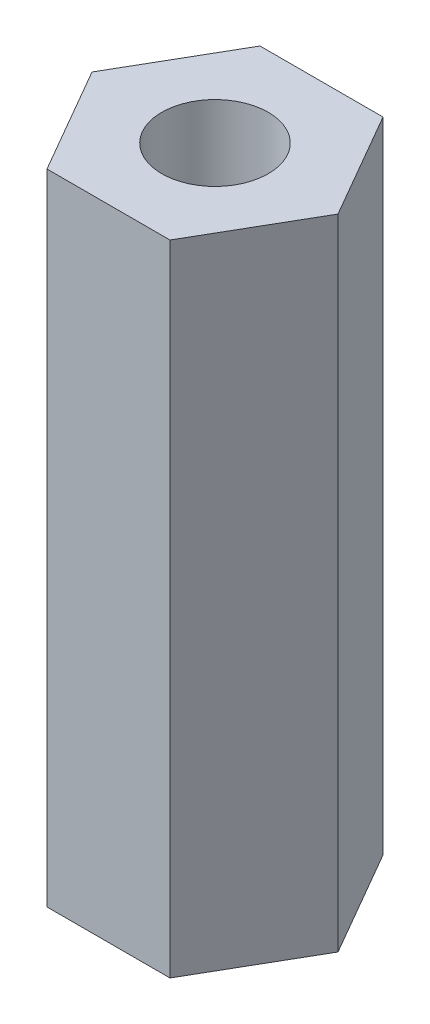
ISO-10303-21;
HEADER;
FILE_DESCRIPTION(('STEP AP214'),'2;1');
FILE_NAME('part.step','',(''),(''),'','','');
FILE_SCHEMA(('AUTOMOTIVE_DESIGN { 1 0 10303 214 1 1 1 1 }'));
ENDSEC;
DATA;
#1=APPLICATION_CONTEXT('core data for automotive mechanical design processes');
#2=APPLICATION_PROTOCOL_DEFINITION('international standard','automotive_design',2000,#1);
#3=PRODUCT_CONTEXT('',#1,'mechanical');
#4=PRODUCT('Part','Part','',(#3));
#5=PRODUCT_RELATED_PRODUCT_CATEGORY('part','',(#4));
#6=PRODUCT_DEFINITION_FORMATION('','',#4);
#7=PRODUCT_DEFINITION_CONTEXT('part definition',#1,'design');
#8=PRODUCT_DEFINITION('design','',#6,#7);
#9=PRODUCT_DEFINITION_SHAPE('','',#8);
#10=(LENGTH_UNIT() NAMED_UNIT(*) SI_UNIT(.MILLI.,.METRE.));
#11=(NAMED_UNIT(*) PLANE_ANGLE_UNIT() SI_UNIT($,.RADIAN.));
#12=(NAMED_UNIT(*) SI_UNIT($,.STERADIAN.) SOLID_ANGLE_UNIT());
#13=UNCERTAINTY_MEASURE_WITH_UNIT(LENGTH_MEASURE(1.E-05),#10,'distance_accuracy_value','');
#14=(GEOMETRIC_REPRESENTATION_CONTEXT(3) GLOBAL_UNCERTAINTY_ASSIGNED_CONTEXT((#13)) GLOBAL_UNIT_ASSIGNED_CONTEXT((#10,
#11,#12)) REPRESENTATION_CONTEXT('',''));
#15=CARTESIAN_POINT('',(0.,0.,0.));
#16=DIRECTION('',(0.,0.,1.));
#17=DIRECTION('',(1.,0.,0.));
#18=AXIS2_PLACEMENT_3D('',#15,#16,#17);
#19=CARTESIAN_POINT('',(0.,38.1,0.));
#20=DIRECTION('',(0.,1.,0.));
#21=DIRECTION('',(0.,0.,1.));
#22=AXIS2_PLACEMENT_3D('',#19,#20,#21);
#23=PLANE('',#22);
#24=DIRECTION('',(0.5,0.,-0.866025403784439));
#25=VECTOR('',#24,1.);
#26=CARTESIAN_POINT('',(3.66617420935413,38.1,6.35));
#27=LINE('',#26,#25);
#28=CARTESIAN_POINT('',(3.66617420935413,38.1,6.35));
#29=VERTEX_POINT('',#28);
#30=CARTESIAN_POINT('',(7.33234841870825,38.1,0.));
#31=VERTEX_POINT('',#30);
#32=EDGE_CURVE('E128',#29,#31,#27,.T.);
#33=ORIENTED_EDGE('',*,*,#32,.T.);
#34=DIRECTION('',(-0.5,0.,-0.866025403784439));
#35=VECTOR('',#34,1.);
#36=CARTESIAN_POINT('',(7.33234841870825,38.1,0.));
#37=LINE('',#36,#35);
#38=CARTESIAN_POINT('',(3.66617420935412,38.1,-6.35000000000001));
#39=VERTEX_POINT('',#38);
#40=EDGE_CURVE('E86',#31,#39,#37,.T.);
#41=ORIENTED_EDGE('',*,*,#40,.T.);
#42=DIRECTION('',(-1.,0.,0.));
#43=VECTOR('',#42,1.);
#44=CARTESIAN_POINT('',(3.66617420935412,38.1,-6.35000000000001));
#45=LINE('',#44,#43);
#46=CARTESIAN_POINT('',(-3.66617420935413,38.1,-6.35000000000001));
#47=VERTEX_POINT('',#46);
#48=EDGE_CURVE('E99',#39,#47,#45,.T.);
#49=ORIENTED_EDGE('',*,*,#48,.T.);
#50=DIRECTION('',(-0.5,0.,0.866025403784439));
#51=VECTOR('',#50,1.);
#52=CARTESIAN_POINT('',(-3.66617420935413,38.1,-6.35000000000001));
#53=LINE('',#52,#51);
#54=CARTESIAN_POINT('',(-7.33234841870825,38.1,0.));
#55=VERTEX_POINT('',#54);
#56=EDGE_CURVE('E93',#47,#55,#53,.T.);
#57=ORIENTED_EDGE('',*,*,#56,.T.);
#58=DIRECTION('',(0.5,0.,0.866025403784439));
#59=VECTOR('',#58,1.);
#60=CARTESIAN_POINT('',(-7.33234841870825,38.1,0.));
#61=LINE('',#60,#59);
#62=CARTESIAN_POINT('',(-3.66617420935413,38.1,6.35000000000001));
#63=VERTEX_POINT('',#62);
#64=EDGE_CURVE('E97',#55,#63,#61,.T.);
#65=ORIENTED_EDGE('',*,*,#64,.T.);
#66=DIRECTION('',(1.,0.,0.));
#67=VECTOR('',#66,1.);
#68=CARTESIAN_POINT('',(-3.66617420935413,38.1,6.35000000000001));
#69=LINE('',#68,#67);
#70=EDGE_CURVE('E49',#63,#29,#69,.T.);
#71=ORIENTED_EDGE('',*,*,#70,.T.);
#72=EDGE_LOOP('',(#33,#41,#49,#57,#65,#71));
#73=FACE_BOUND('',#72,.T.);
#74=CARTESIAN_POINT('',(0.,38.1,0.));
#75=DIRECTION('',(0.,1.,0.));
#76=DIRECTION('',(0.,0.,1.));
#77=AXIS2_PLACEMENT_3D('',#74,#75,#76);
#78=CIRCLE('',#77,3.175);
#79=CARTESIAN_POINT('',(0.,38.1,-3.175));
#80=VERTEX_POINT('',#79);
#81=EDGE_CURVE('E121',#80,#80,#78,.T.);
#82=ORIENTED_EDGE('',*,*,#81,.F.);
#83=EDGE_LOOP('',(#82));
#84=FACE_BOUND('',#83,.T.);
#85=ADVANCED_FACE('F32',(#73,#84),#23,.T.);
#86=CARTESIAN_POINT('',(0.,0.,0.));
#87=DIRECTION('',(0.,1.,0.));
#88=DIRECTION('',(0.,0.,1.));
#89=AXIS2_PLACEMENT_3D('',#86,#87,#88);
#90=PLANE('',#89);
#91=DIRECTION('',(0.5,0.,-0.866025403784439));
#92=VECTOR('',#91,1.);
#93=CARTESIAN_POINT('',(3.66617420935413,0.,6.35));
#94=LINE('',#93,#92);
#95=CARTESIAN_POINT('',(3.66617420935413,0.,6.35));
#96=VERTEX_POINT('',#95);
#97=CARTESIAN_POINT('',(7.33234841870825,0.,0.));
#98=VERTEX_POINT('',#97);
#99=EDGE_CURVE('E117',#96,#98,#94,.T.);
#100=ORIENTED_EDGE('',*,*,#99,.F.);
#101=DIRECTION('',(1.,0.,0.));
#102=VECTOR('',#101,1.);
#103=CARTESIAN_POINT('',(-3.66617420935413,0.,6.35000000000001));
#104=LINE('',#103,#102);
#105=CARTESIAN_POINT('',(-3.66617420935413,0.,6.35000000000001));
#106=VERTEX_POINT('',#105);
#107=EDGE_CURVE('E78',#106,#96,#104,.T.);
#108=ORIENTED_EDGE('',*,*,#107,.F.);
#109=DIRECTION('',(0.5,0.,0.866025403784439));
#110=VECTOR('',#109,1.);
#111=CARTESIAN_POINT('',(-7.33234841870825,0.,0.));
#112=LINE('',#111,#110);
#113=CARTESIAN_POINT('',(-7.33234841870825,0.,0.));
#114=VERTEX_POINT('',#113);
#115=EDGE_CURVE('E72',#114,#106,#112,.T.);
#116=ORIENTED_EDGE('',*,*,#115,.F.);
#117=DIRECTION('',(-0.5,0.,0.866025403784439));
#118=VECTOR('',#117,1.);
#119=CARTESIAN_POINT('',(-3.66617420935413,0.,-6.35000000000001));
#120=LINE('',#119,#118);
#121=CARTESIAN_POINT('',(-3.66617420935413,0.,-6.35000000000001));
#122=VERTEX_POINT('',#121);
#123=EDGE_CURVE('E107',#122,#114,#120,.T.);
#124=ORIENTED_EDGE('',*,*,#123,.F.);
#125=DIRECTION('',(-1.,0.,0.));
#126=VECTOR('',#125,1.);
#127=CARTESIAN_POINT('',(3.66617420935412,0.,-6.35000000000001));
#128=LINE('',#127,#126);
#129=CARTESIAN_POINT('',(3.66617420935412,0.,-6.35000000000001));
#130=VERTEX_POINT('',#129);
#131=EDGE_CURVE('E123',#130,#122,#128,.T.);
#132=ORIENTED_EDGE('',*,*,#131,.F.);
#133=DIRECTION('',(-0.5,0.,-0.866025403784439));
#134=VECTOR('',#133,1.);
#135=CARTESIAN_POINT('',(7.33234841870825,0.,0.));
#136=LINE('',#135,#134);
#137=EDGE_CURVE('E120',#98,#130,#136,.T.);
#138=ORIENTED_EDGE('',*,*,#137,.F.);
#139=EDGE_LOOP('',(#100,#108,#116,#124,#132,#138));
#140=FACE_BOUND('',#139,.T.);
#141=CARTESIAN_POINT('',(0.,0.,0.));
#142=DIRECTION('',(0.,1.,0.));
#143=DIRECTION('',(0.,0.,1.));
#144=AXIS2_PLACEMENT_3D('',#141,#142,#143);
#145=CIRCLE('',#144,3.175);
#146=CARTESIAN_POINT('',(0.,0.,-3.175));
#147=VERTEX_POINT('',#146);
#148=EDGE_CURVE('E221',#147,#147,#145,.T.);
#149=ORIENTED_EDGE('',*,*,#148,.T.);
#150=EDGE_LOOP('',(#149));
#151=FACE_BOUND('',#150,.T.);
#152=ADVANCED_FACE('F137',(#140,#151),#90,.F.);
#153=CARTESIAN_POINT('',(3.66617420935413,38.1,6.35));
#154=DIRECTION('',(-0.866025403784439,0.,-0.5));
#155=DIRECTION('',(-0.5,0.,0.866025403784439));
#156=AXIS2_PLACEMENT_3D('',#153,#154,#155);
#157=PLANE('',#156);
#158=ORIENTED_EDGE('',*,*,#99,.T.);
#159=DIRECTION('',(0.,-1.,0.));
#160=VECTOR('',#159,1.);
#161=CARTESIAN_POINT('',(7.33234841870825,38.1,0.));
#162=LINE('',#161,#160);
#163=EDGE_CURVE('E11',#31,#98,#162,.T.);
#164=ORIENTED_EDGE('',*,*,#163,.F.);
#165=ORIENTED_EDGE('',*,*,#32,.F.);
#166=DIRECTION('',(0.,-1.,0.));
#167=VECTOR('',#166,1.);
#168=CARTESIAN_POINT('',(3.66617420935413,38.1,6.35));
#169=LINE('',#168,#167);
#170=EDGE_CURVE('E113',#29,#96,#169,.T.);
#171=ORIENTED_EDGE('',*,*,#170,.T.);
#172=EDGE_LOOP('',(#158,#164,#165,#171));
#173=FACE_BOUND('',#172,.T.);
#174=ADVANCED_FACE('F34',(#173),#157,.F.);
#175=CARTESIAN_POINT('',(7.33234841870825,38.1,0.));
#176=DIRECTION('',(-0.866025403784439,0.,0.5));
#177=DIRECTION('',(0.5,0.,0.866025403784439));
#178=AXIS2_PLACEMENT_3D('',#175,#176,#177);
#179=PLANE('',#178);
#180=ORIENTED_EDGE('',*,*,#137,.T.);
#181=DIRECTION('',(0.,-1.,0.));
#182=VECTOR('',#181,1.);
#183=CARTESIAN_POINT('',(3.66617420935412,38.1,-6.35000000000001));
#184=LINE('',#183,#182);
#185=EDGE_CURVE('E41',#39,#130,#184,.T.);
#186=ORIENTED_EDGE('',*,*,#185,.F.);
#187=ORIENTED_EDGE('',*,*,#40,.F.);
#188=ORIENTED_EDGE('',*,*,#163,.T.);
#189=EDGE_LOOP('',(#180,#186,#187,#188));
#190=FACE_BOUND('',#189,.T.);
#191=ADVANCED_FACE('F162',(#190),#179,.F.);
#192=CARTESIAN_POINT('',(3.66617420935412,38.1,-6.35000000000001));
#193=DIRECTION('',(0.,0.,1.));
#194=DIRECTION('',(1.,0.,0.));
#195=AXIS2_PLACEMENT_3D('',#192,#193,#194);
#196=PLANE('',#195);
#197=ORIENTED_EDGE('',*,*,#131,.T.);
#198=DIRECTION('',(0.,-1.,0.));
#199=VECTOR('',#198,1.);
#200=CARTESIAN_POINT('',(-3.66617420935413,38.1,-6.35000000000001));
#201=LINE('',#200,#199);
#202=EDGE_CURVE('E108',#47,#122,#201,.T.);
#203=ORIENTED_EDGE('',*,*,#202,.F.);
#204=ORIENTED_EDGE('',*,*,#48,.F.);
#205=ORIENTED_EDGE('',*,*,#185,.T.);
#206=EDGE_LOOP('',(#197,#203,#204,#205));
#207=FACE_BOUND('',#206,.T.);
#208=ADVANCED_FACE('F134',(#207),#196,.F.);
#209=CARTESIAN_POINT('',(-3.66617420935413,38.1,-6.35000000000001));
#210=DIRECTION('',(0.866025403784439,0.,0.5));
#211=DIRECTION('',(0.5,0.,-0.866025403784439));
#212=AXIS2_PLACEMENT_3D('',#209,#210,#211);
#213=PLANE('',#212);
#214=ORIENTED_EDGE('',*,*,#123,.T.);
#215=DIRECTION('',(0.,-1.,0.));
#216=VECTOR('',#215,1.);
#217=CARTESIAN_POINT('',(-7.33234841870825,38.1,0.));
#218=LINE('',#217,#216);
#219=EDGE_CURVE('E104',#55,#114,#218,.T.);
#220=ORIENTED_EDGE('',*,*,#219,.F.);
#221=ORIENTED_EDGE('',*,*,#56,.F.);
#222=ORIENTED_EDGE('',*,*,#202,.T.);
#223=EDGE_LOOP('',(#214,#220,#221,#222));
#224=FACE_BOUND('',#223,.T.);
#225=ADVANCED_FACE('F105',(#224),#213,.F.);
#226=CARTESIAN_POINT('',(-7.33234841870825,38.1,0.));
#227=DIRECTION('',(0.866025403784439,0.,-0.5));
#228=DIRECTION('',(-0.5,0.,-0.866025403784439));
#229=AXIS2_PLACEMENT_3D('',#226,#227,#228);
#230=PLANE('',#229);
#231=ORIENTED_EDGE('',*,*,#115,.T.);
#232=DIRECTION('',(0.,-1.,0.));
#233=VECTOR('',#232,1.);
#234=CARTESIAN_POINT('',(-3.66617420935413,38.1,6.35000000000001));
#235=LINE('',#234,#233);
#236=EDGE_CURVE('E109',#63,#106,#235,.T.);
#237=ORIENTED_EDGE('',*,*,#236,.F.);
#238=ORIENTED_EDGE('',*,*,#64,.F.);
#239=ORIENTED_EDGE('',*,*,#219,.T.);
#240=EDGE_LOOP('',(#231,#237,#238,#239));
#241=FACE_BOUND('',#240,.T.);
#242=ADVANCED_FACE('F111',(#241),#230,.F.);
#243=CARTESIAN_POINT('',(-3.66617420935413,38.1,6.35000000000001));
#244=DIRECTION('',(0.,0.,-1.));
#245=DIRECTION('',(-1.,0.,0.));
#246=AXIS2_PLACEMENT_3D('',#243,#244,#245);
#247=PLANE('',#246);
#248=ORIENTED_EDGE('',*,*,#107,.T.);
#249=ORIENTED_EDGE('',*,*,#170,.F.);
#250=ORIENTED_EDGE('',*,*,#70,.F.);
#251=ORIENTED_EDGE('',*,*,#236,.T.);
#252=EDGE_LOOP('',(#248,#249,#250,#251));
#253=FACE_BOUND('',#252,.T.);
#254=ADVANCED_FACE('F142',(#253),#247,.F.);
#255=CARTESIAN_POINT('',(0.,38.1,0.));
#256=DIRECTION('',(0.,-1.,0.));
#257=DIRECTION('',(0.,0.,-1.));
#258=AXIS2_PLACEMENT_3D('',#255,#256,#257);
#259=CYLINDRICAL_SURFACE('',#258,3.175);
#260=CARTESIAN_POINT('',(0.,38.1,-3.175));
#261=CARTESIAN_POINT('',(0.,37.703125,-3.175));
#262=CARTESIAN_POINT('',(0.,37.30625,-3.175));
#263=CARTESIAN_POINT('',(0.,36.5125,-3.175));
#264=CARTESIAN_POINT('',(0.,36.115625,-3.175));
#265=CARTESIAN_POINT('',(0.,35.321875,-3.175));
#266=CARTESIAN_POINT('',(0.,34.925,-3.175));
#267=CARTESIAN_POINT('',(0.,34.13125,-3.175));
#268=CARTESIAN_POINT('',(0.,33.734375,-3.175));
#269=CARTESIAN_POINT('',(0.,32.940625,-3.175));
#270=CARTESIAN_POINT('',(0.,32.54375,-3.175));
#271=CARTESIAN_POINT('',(0.,31.75,-3.175));
#272=CARTESIAN_POINT('',(0.,31.353125,-3.175));
#273=CARTESIAN_POINT('',(0.,30.559375,-3.175));
#274=CARTESIAN_POINT('',(0.,30.1625,-3.175));
#275=CARTESIAN_POINT('',(0.,29.36875,-3.175));
#276=CARTESIAN_POINT('',(0.,28.971875,-3.175));
#277=CARTESIAN_POINT('',(0.,28.178125,-3.175));
#278=CARTESIAN_POINT('',(0.,27.78125,-3.175));
#279=CARTESIAN_POINT('',(0.,26.9875,-3.175));
#280=CARTESIAN_POINT('',(0.,26.590625,-3.175));
#281=CARTESIAN_POINT('',(0.,25.796875,-3.175));
#282=CARTESIAN_POINT('',(0.,25.4,-3.175));
#283=CARTESIAN_POINT('',(0.,24.60625,-3.175));
#284=CARTESIAN_POINT('',(0.,24.209375,-3.175));
#285=CARTESIAN_POINT('',(0.,23.415625,-3.175));
#286=CARTESIAN_POINT('',(0.,23.01875,-3.175));
#287=CARTESIAN_POINT('',(0.,22.225,-3.175));
#288=CARTESIAN_POINT('',(0.,21.828125,-3.175));
#289=CARTESIAN_POINT('',(0.,21.034375,-3.175));
#290=CARTESIAN_POINT('',(0.,20.6375,-3.175));
#291=CARTESIAN_POINT('',(0.,19.84375,-3.175));
#292=CARTESIAN_POINT('',(0.,19.446875,-3.175));
#293=CARTESIAN_POINT('',(0.,18.653125,-3.175));
#294=CARTESIAN_POINT('',(0.,18.25625,-3.175));
#295=CARTESIAN_POINT('',(0.,17.4625,-3.175));
#296=CARTESIAN_POINT('',(0.,17.065625,-3.175));
#297=CARTESIAN_POINT('',(0.,16.271875,-3.175));
#298=CARTESIAN_POINT('',(0.,15.875,-3.175));
#299=CARTESIAN_POINT('',(0.,15.08125,-3.175));
#300=CARTESIAN_POINT('',(0.,14.684375,-3.175));
#301=CARTESIAN_POINT('',(0.,13.890625,-3.175));
#302=CARTESIAN_POINT('',(0.,13.49375,-3.175));
#303=CARTESIAN_POINT('',(0.,12.7,-3.175));
#304=CARTESIAN_POINT('',(0.,12.303125,-3.175));
#305=CARTESIAN_POINT('',(0.,11.509375,-3.175));
#306=CARTESIAN_POINT('',(0.,11.1125,-3.175));
#307=CARTESIAN_POINT('',(0.,10.31875,-3.175));
#308=CARTESIAN_POINT('',(0.,9.921875,-3.175));
#309=CARTESIAN_POINT('',(0.,9.128125,-3.175));
#310=CARTESIAN_POINT('',(0.,8.73125,-3.175));
#311=CARTESIAN_POINT('',(0.,7.9375,-3.175));
#312=CARTESIAN_POINT('',(0.,7.540625,-3.175));
#313=CARTESIAN_POINT('',(0.,6.746875,-3.175));
#314=CARTESIAN_POINT('',(0.,6.35,-3.175));
#315=CARTESIAN_POINT('',(0.,5.55625,-3.175));
#316=CARTESIAN_POINT('',(0.,5.159375,-3.175));
#317=CARTESIAN_POINT('',(0.,4.365625,-3.175));
#318=CARTESIAN_POINT('',(0.,3.96875,-3.175));
#319=CARTESIAN_POINT('',(0.,3.175,-3.175));
#320=CARTESIAN_POINT('',(0.,2.778125,-3.175));
#321=CARTESIAN_POINT('',(0.,1.984375,-3.175));
#322=CARTESIAN_POINT('',(0.,1.5875,-3.175));
#323=CARTESIAN_POINT('',(0.,0.79375,-3.175));
#324=CARTESIAN_POINT('',(0.,0.396875,-3.175));
#325=CARTESIAN_POINT('',(0.,0.,-3.175));
#326=B_SPLINE_CURVE_WITH_KNOTS('',3,(#260,#261,#262,#263,#264,#265,#266,#267,#268,#269,#270,
#271,#272,#273,#274,#275,#276,#277,#278,#279,#280,#281,#282,#283,#284,#285,#286,#287,#288,#289,
#290,#291,#292,#293,#294,#295,#296,#297,#298,#299,#300,#301,#302,#303,#304,#305,#306,#307,#308,
#309,#310,#311,#312,#313,#314,#315,#316,#317,#318,#319,#320,#321,#322,#323,#324,#325),
.UNSPECIFIED.,.F.,.F.,(4,2,2,2,2,2,2,2,2,2,2,2,2,2,2,2,2,2,2,2,2,2,2,2,2,2,2,2,2,2,2,2,4),(0.,
1.19062499999999,2.38124999999999,3.571875,4.7625,5.953125,7.14375,8.33437499999999,9.525,
10.715625,11.90625,13.096875,14.2875,15.478125,16.66875,17.859375,19.05,20.240625,21.43125,
22.621875,23.8125,25.003125,26.19375,27.384375,28.575,29.765625,30.95625,32.146875,33.3375,
34.528125,35.71875,36.909375,38.1),.UNSPECIFIED.);
#327=EDGE_CURVE('BSEAM144',#80,#147,#326,.T.);
#328=ORIENTED_EDGE('',*,*,#81,.T.);
#329=ORIENTED_EDGE('',*,*,#148,.F.);
#330=ORIENTED_EDGE('',*,*,#327,.T.);
#331=ORIENTED_EDGE('',*,*,#327,.F.);
#332=EDGE_LOOP('',(#328,#330,#329,#331));
#333=FACE_BOUND('',#332,.T.);
#334=ADVANCED_FACE('F144',(#333),#259,.F.);
#335=CLOSED_SHELL('',(#85,#152,#174,#191,#208,#225,#242,#254,#334));
#336=MANIFOLD_SOLID_BREP('B2',#335);
#337=ADVANCED_BREP_SHAPE_REPRESENTATION('',(#18,#336),#14);
#338=SHAPE_DEFINITION_REPRESENTATION(#9,#337);
ENDSEC;
END-ISO-10303-21;
